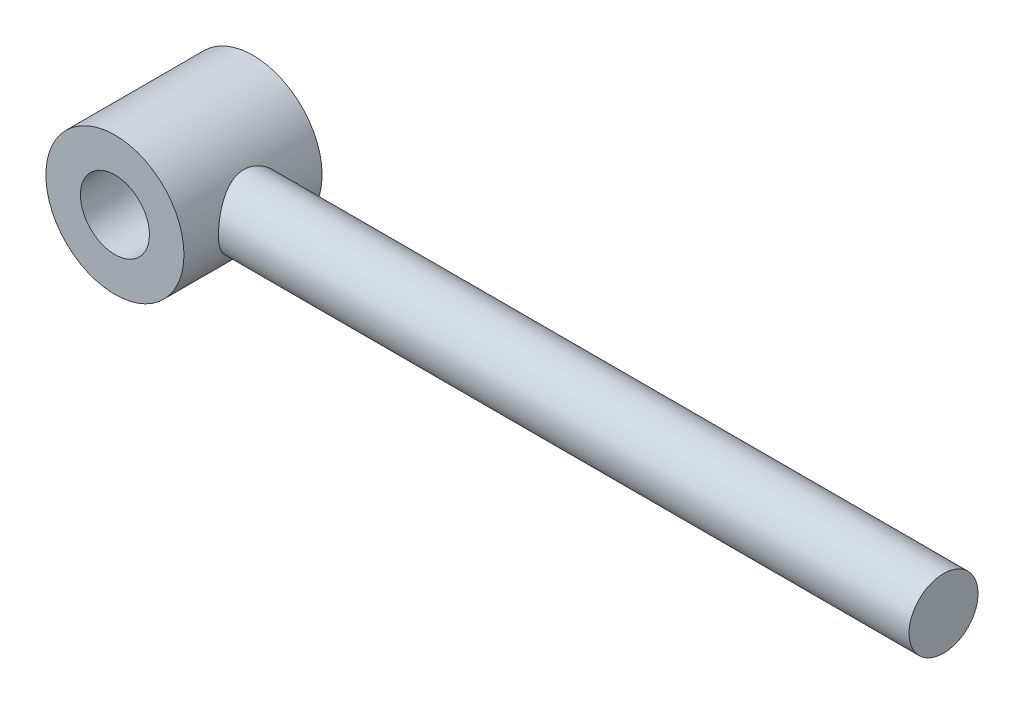
ISO-10303-21;
HEADER;
FILE_DESCRIPTION(('STEP AP214'),'2;1');
FILE_NAME('part.step','',(''),(''),'','','');
FILE_SCHEMA(('AUTOMOTIVE_DESIGN { 1 0 10303 214 1 1 1 1 }'));
ENDSEC;
DATA;
#1=APPLICATION_CONTEXT('core data for automotive mechanical design processes');
#2=APPLICATION_PROTOCOL_DEFINITION('international standard','automotive_design',2000,#1);
#3=PRODUCT_CONTEXT('',#1,'mechanical');
#4=PRODUCT('Part','Part','',(#3));
#5=PRODUCT_RELATED_PRODUCT_CATEGORY('part','',(#4));
#6=PRODUCT_DEFINITION_FORMATION('','',#4);
#7=PRODUCT_DEFINITION_CONTEXT('part definition',#1,'design');
#8=PRODUCT_DEFINITION('design','',#6,#7);
#9=PRODUCT_DEFINITION_SHAPE('','',#8);
#10=(LENGTH_UNIT() NAMED_UNIT(*) SI_UNIT(.MILLI.,.METRE.));
#11=(NAMED_UNIT(*) PLANE_ANGLE_UNIT() SI_UNIT($,.RADIAN.));
#12=(NAMED_UNIT(*) SI_UNIT($,.STERADIAN.) SOLID_ANGLE_UNIT());
#13=UNCERTAINTY_MEASURE_WITH_UNIT(LENGTH_MEASURE(1.E-05),#10,'distance_accuracy_value','');
#14=(GEOMETRIC_REPRESENTATION_CONTEXT(3) GLOBAL_UNCERTAINTY_ASSIGNED_CONTEXT((#13)) GLOBAL_UNIT_ASSIGNED_CONTEXT((#10,
#11,#12)) REPRESENTATION_CONTEXT('',''));
#15=CARTESIAN_POINT('',(0.,0.,0.));
#16=DIRECTION('',(0.,0.,1.));
#17=DIRECTION('',(1.,0.,0.));
#18=AXIS2_PLACEMENT_3D('',#15,#16,#17);
#19=CARTESIAN_POINT('',(0.,0.,20.));
#20=DIRECTION('',(0.,0.,-1.));
#21=DIRECTION('',(-1.,0.,0.));
#22=AXIS2_PLACEMENT_3D('',#19,#20,#21);
#23=CYLINDRICAL_SURFACE('',#22,10.);
#24=CARTESIAN_POINT('',(0.,0.,20.));
#25=DIRECTION('',(0.,0.,1.));
#26=DIRECTION('',(1.,0.,0.));
#27=AXIS2_PLACEMENT_3D('',#24,#25,#26);
#28=CIRCLE('',#27,10.);
#29=CARTESIAN_POINT('',(10.,0.,20.));
#30=VERTEX_POINT('',#29);
#31=EDGE_CURVE('E54',#30,#30,#28,.T.);
#32=ORIENTED_EDGE('',*,*,#31,.F.);
#33=EDGE_LOOP('',(#32));
#34=FACE_BOUND('',#33,.T.);
#35=CARTESIAN_POINT('',(0.,0.,0.));
#36=DIRECTION('',(0.,0.,1.));
#37=DIRECTION('',(1.,0.,0.));
#38=AXIS2_PLACEMENT_3D('',#35,#36,#37);
#39=CIRCLE('',#38,10.);
#40=CARTESIAN_POINT('',(10.,0.,0.));
#41=VERTEX_POINT('',#40);
#42=EDGE_CURVE('E58',#41,#41,#39,.T.);
#43=ORIENTED_EDGE('',*,*,#42,.T.);
#44=EDGE_LOOP('',(#43));
#45=FACE_BOUND('',#44,.T.);
#46=CARTESIAN_POINT('',(10.,0.,5.00000000000007));
#47=CARTESIAN_POINT('',(9.99999960171885,0.131488890078729,5.0000004322161));
#48=CARTESIAN_POINT('',(9.99740053121284,0.262986970217152,5.00519277528519));
#49=CARTESIAN_POINT('',(9.98706977835168,0.525014586348057,5.0259028941121));
#50=CARTESIAN_POINT('',(9.97933586314931,0.655543676003296,5.04142516176405));
#51=CARTESIAN_POINT('',(9.95892066969002,0.914783203431135,5.08264077947741));
#52=CARTESIAN_POINT('',(9.94623233642882,1.04349077535257,5.10834863440631));
#53=CARTESIAN_POINT('',(9.91622716576671,1.29802636754293,5.16965067256353));
#54=CARTESIAN_POINT('',(9.89890843630383,1.42385318781692,5.2052488974057));
#55=CARTESIAN_POINT('',(9.86015430154804,1.67121386584967,5.28577848245137));
#56=CARTESIAN_POINT('',(9.83873709670758,1.79276399094562,5.33066864854812));
#57=CARTESIAN_POINT('',(9.79224427489324,2.0314444775119,5.42944879780702));
#58=CARTESIAN_POINT('',(9.7671672814684,2.14857315511666,5.48334216819352));
#59=CARTESIAN_POINT('',(9.68730860488736,2.49222561412915,5.65779962893905));
#60=CARTESIAN_POINT('',(9.6278546021617,2.71128846115304,5.79123077324013));
#61=CARTESIAN_POINT('',(9.49780663424161,3.13758045755124,6.09760528124462));
#62=CARTESIAN_POINT('',(9.42675632671347,3.34329192972868,6.27245069027979));
#63=CARTESIAN_POINT('',(9.28300214475253,3.72388133818108,6.65258908828323));
#64=CARTESIAN_POINT('',(9.21029705743542,3.89873577832563,6.85790506198392));
#65=CARTESIAN_POINT('',(9.06493867332992,4.22628385620055,7.31247514746435));
#66=CARTESIAN_POINT('',(8.99272664170301,4.37620734766694,7.56390189131755));
#67=CARTESIAN_POINT('',(8.89637417546677,4.56723365243868,7.95991804436766));
#68=CARTESIAN_POINT('',(8.86624279684719,4.62527981130998,8.09511829056034));
#69=CARTESIAN_POINT('',(8.81109611627222,4.72948843578257,8.37100125177413));
#70=CARTESIAN_POINT('',(8.78607778701962,4.77565793744269,8.51168066363924));
#71=CARTESIAN_POINT('',(8.74350562362058,4.8531380584616,8.78899275415604));
#72=CARTESIAN_POINT('',(8.72559704108876,4.88516762296958,8.925370479978));
#73=CARTESIAN_POINT('',(8.69596333711106,4.93772573892405,9.20092569747969));
#74=CARTESIAN_POINT('',(8.68423493515241,4.95826039236648,9.34010166300617));
#75=CARTESIAN_POINT('',(8.66746161087014,4.98752398958936,9.6200074611113));
#76=CARTESIAN_POINT('',(8.66241266349288,4.99626004329765,9.76073630631417));
#77=CARTESIAN_POINT('',(8.65921299638945,5.00180399494055,10.0425011762897));
#78=CARTESIAN_POINT('',(8.66106161851229,4.99861303092504,10.1835371704714));
#79=CARTESIAN_POINT('',(8.67093727173593,4.98145803092846,10.447703572877));
#80=CARTESIAN_POINT('',(8.6781966350113,4.96883208371091,10.5709526028103));
#81=CARTESIAN_POINT('',(8.69773906996623,4.93454402662215,10.8158212139672));
#82=CARTESIAN_POINT('',(8.71002371946268,4.91287907868334,10.937440271022));
#83=CARTESIAN_POINT('',(8.73921479576949,4.86076278292653,11.1781978743128));
#84=CARTESIAN_POINT('',(8.75612065195561,4.83031251988904,11.2973367248501));
#85=CARTESIAN_POINT('',(8.79403073984606,4.76094319159974,11.5324713769545));
#86=CARTESIAN_POINT('',(8.81503658165343,4.72202079856857,11.6484659232761));
#87=CARTESIAN_POINT('',(8.88436032421636,4.59108661358502,11.9960068716187));
#88=CARTESIAN_POINT('',(8.93828791833521,4.48608785825887,12.2216933560379));
#89=CARTESIAN_POINT('',(9.05517433078603,4.24519591002764,12.6532101182229));
#90=CARTESIAN_POINT('',(9.11813720101033,4.10928884013355,12.8590314177593));
#91=CARTESIAN_POINT('',(9.25565455759079,3.79034422310328,13.2725885282039));
#92=CARTESIAN_POINT('',(9.3306665420313,3.60351571642877,13.4772580077074));
#93=CARTESIAN_POINT('',(9.47739013910051,3.19773444843253,13.8537034656888));
#94=CARTESIAN_POINT('',(9.54910016205801,2.97876642220598,14.0254637238213));
#95=CARTESIAN_POINT('',(9.65034506582221,2.62430600098781,14.2584408971133));
#96=CARTESIAN_POINT('',(9.68370380274255,2.49871002336159,14.3333520951456));
#97=CARTESIAN_POINT('',(9.74663052718473,2.2407106014256,14.4722082029725));
#98=CARTESIAN_POINT('',(9.77620011135783,2.10831005755409,14.5361577355912));
#99=CARTESIAN_POINT('',(9.83067553510546,1.83762803314803,14.6523988753835));
#100=CARTESIAN_POINT('',(9.85558325144946,1.69934894682178,14.7046951755249));
#101=CARTESIAN_POINT('',(9.89999026457503,1.41791187896083,14.79702492908));
#102=CARTESIAN_POINT('',(9.91949018350378,1.27475446078987,14.8370597931822));
#103=CARTESIAN_POINT('',(9.95109597328192,0.996798015430409,14.9015335635031));
#104=CARTESIAN_POINT('',(9.96368046334326,0.862288674029794,14.9269895154025));
#105=CARTESIAN_POINT('',(9.98343035732268,0.591248360012463,14.9668080412237));
#106=CARTESIAN_POINT('',(9.99059624028198,0.454717567193948,14.9811715957902));
#107=CARTESIAN_POINT('',(9.99930380487356,0.180810709359644,14.9986131620341));
#108=CARTESIAN_POINT('',(10.000847639673,0.0434349881358962,15.001695494267));
#109=CARTESIAN_POINT('',(9.99827237859039,-0.231047608581554,14.9965444260813));
#110=CARTESIAN_POINT('',(9.99415353332644,-0.368154495704343,14.9883115264508));
#111=CARTESIAN_POINT('',(9.98090973082445,-0.630324023952247,14.961721326159));
#112=CARTESIAN_POINT('',(9.97219922243105,-0.75549375124322,14.9442016224067));
#113=CARTESIAN_POINT('',(9.95027227352716,-1.00380426086804,14.8998255264295));
#114=CARTESIAN_POINT('',(9.93705440583578,-1.12694438760008,14.8729661769068));
#115=CARTESIAN_POINT('',(9.90642450404114,-1.37032307172126,14.8101973166376));
#116=CARTESIAN_POINT('',(9.88901375346268,-1.49056250470176,14.7742905753219));
#117=CARTESIAN_POINT('',(9.85039368148873,-1.72747946867538,14.6937718386769));
#118=CARTESIAN_POINT('',(9.82918290524069,-1.84415561535681,14.6491565086474));
#119=CARTESIAN_POINT('',(9.75922876416582,-2.19430354472275,14.5000521931498));
#120=CARTESIAN_POINT('',(9.70504904478179,-2.42111320848944,14.382059258215));
#121=CARTESIAN_POINT('',(9.58719375745592,-2.8523456015808,14.1144478067804));
#122=CARTESIAN_POINT('',(9.52351414776381,-3.05675873773466,13.9648158180078));
#123=CARTESIAN_POINT('',(9.38541505392104,-3.45882132675025,13.6212127089634));
#124=CARTESIAN_POINT('',(9.31055499361995,-3.65383533419945,13.4243304082476));
#125=CARTESIAN_POINT('',(9.16310881759143,-4.00930667677967,13.0003294628661));
#126=CARTESIAN_POINT('',(9.09052430437332,-4.16974010650664,12.7731900760017));
#127=CARTESIAN_POINT('',(8.98785260582618,-4.38466016919211,12.4075094337708));
#128=CARTESIAN_POINT('',(8.95395955241383,-4.4532676226712,12.2781491254566));
#129=CARTESIAN_POINT('',(8.89022352415078,-4.57918112262683,12.0131058992211));
#130=CARTESIAN_POINT('',(8.86037871680369,-4.63649228788887,11.8774258796241));
#131=CARTESIAN_POINT('',(8.80590327365628,-4.73913999074898,11.6007229646748));
#132=CARTESIAN_POINT('',(8.78126837994729,-4.78448631442401,11.45970454425));
#133=CARTESIAN_POINT('',(8.73822819098157,-4.86265004333096,11.1733089571752));
#134=CARTESIAN_POINT('',(8.7198219312185,-4.89546938847111,11.0279324691725));
#135=CARTESIAN_POINT('',(8.69151275671387,-4.94553834792943,10.7482350184648));
#136=CARTESIAN_POINT('',(8.6809632703526,-4.96397997433445,10.6141921168801));
#137=CARTESIAN_POINT('',(8.66606824539578,-4.98993873206133,10.3447147543027));
#138=CARTESIAN_POINT('',(8.66172205679783,-4.99745700797003,10.2092804406049));
#139=CARTESIAN_POINT('',(8.65941425656731,-5.00145477351748,9.93824307499543));
#140=CARTESIAN_POINT('',(8.66145040076354,-4.99793814327599,9.80264009915044));
#141=CARTESIAN_POINT('',(8.67181681785816,-4.97992974203946,9.53241444205219));
#142=CARTESIAN_POINT('',(8.68014683308828,-4.96543842034336,9.39779172089553));
#143=CARTESIAN_POINT('',(8.70167828744801,-4.92759757627216,9.14343979784105));
#144=CARTESIAN_POINT('',(8.71433770908853,-4.90522766015,9.02351744037614));
#145=CARTESIAN_POINT('',(8.74411599480516,-4.85194376743194,8.78613880943259));
#146=CARTESIAN_POINT('',(8.76123623781642,-4.82102714868722,8.66868331066602));
#147=CARTESIAN_POINT('',(8.81854231868725,-4.71590306073959,8.32108288488716));
#148=CARTESIAN_POINT('',(8.8646881377113,-4.62929708984156,8.09554390501406));
#149=CARTESIAN_POINT('',(8.97142890954605,-4.4190716467502,7.64683965768755));
#150=CARTESIAN_POINT('',(9.03278633647389,-4.29335633682031,7.42485192401071));
#151=CARTESIAN_POINT('',(9.1617663649522,-4.01075421010744,7.00363589040434));
#152=CARTESIAN_POINT('',(9.22939221620456,-3.85385117607732,6.80441951655589));
#153=CARTESIAN_POINT('',(9.37311444600789,-3.49102748964406,6.40929214152935));
#154=CARTESIAN_POINT('',(9.44924162905911,-3.28146736342599,6.21672398123245));
#155=CARTESIAN_POINT('',(9.59389514971535,-2.83072875767415,5.86866557881679));
#156=CARTESIAN_POINT('',(9.66241737976037,-2.58953334336126,5.7131953222565));
#157=CARTESIAN_POINT('',(9.7541901337583,-2.20753881885374,5.51136958547325));
#158=CARTESIAN_POINT('',(9.78304209980294,-2.0762551257027,5.44913292059369));
#159=CARTESIAN_POINT('',(9.83614745234556,-1.80799529933998,5.33606384387969));
#160=CARTESIAN_POINT('',(9.8604030970797,-1.67102200205151,5.28522582946945));
#161=CARTESIAN_POINT('',(9.90354484128718,-1.39269501068688,5.19565456163288));
#162=CARTESIAN_POINT('',(9.92244264379385,-1.25135162347081,5.15689490701236));
#163=CARTESIAN_POINT('',(9.95434618112011,-0.965237205795559,5.0918624037315));
#164=CARTESIAN_POINT('',(9.96735551489675,-0.820468326048375,5.06558192747304));
#165=CARTESIAN_POINT('',(9.98476387878718,-0.563041654408161,5.03052546800121));
#166=CARTESIAN_POINT('',(9.99046741601666,-0.450825809730025,5.01908824630805));
#167=CARTESIAN_POINT('',(9.99808569986015,-0.225742246050265,5.00382522174992));
#168=CARTESIAN_POINT('',(10.000000341898,-0.112874509142188,4.99999962897122));
#169=CARTESIAN_POINT('',(10.,0.,5.00000000000007));
#170=B_SPLINE_CURVE_WITH_KNOTS('',3,(#46,#47,#48,#49,#50,#51,#52,#53,#54,#55,#56,#57,#58,#59,
#60,#61,#62,#63,#64,#65,#66,#67,#68,#69,#70,#71,#72,#73,#74,#75,#76,#77,#78,#79,#80,#81,#82,#83,
#84,#85,#86,#87,#88,#89,#90,#91,#92,#93,#94,#95,#96,#97,#98,#99,#100,#101,#102,#103,#104,#105,
#106,#107,#108,#109,#110,#111,#112,#113,#114,#115,#116,#117,#118,#119,#120,#121,#122,#123,#124,
#125,#126,#127,#128,#129,#130,#131,#132,#133,#134,#135,#136,#137,#138,#139,#140,#141,#142,#143,
#144,#145,#146,#147,#148,#149,#150,#151,#152,#153,#154,#155,#156,#157,#158,#159,#160,#161,#162,
#163,#164,#165,#166,#167,#168,#169),.UNSPECIFIED.,.T.,.F.,(4,2,2,2,2,2,2,2,2,2,2,2,2,2,2,2,2,2,
2,2,2,2,2,2,2,2,2,2,2,2,2,2,2,2,2,2,2,2,2,2,2,2,2,2,2,2,2,2,2,2,2,2,2,2,2,2,2,2,2,2,2,4),(0.,
0.394355294649891,0.788882184037819,1.18397293369035,1.57922537181693,1.97276168530542,
2.36644639154632,3.15295441699267,3.98704440767527,4.82176680235501,5.72122193562246,
6.17125359989459,6.62101803579305,7.04410338623952,7.46696393118358,7.88956954321096,
8.3121348321667,8.68401534897462,9.05601271689168,9.42796417149684,9.80006198990959,
10.56083380205,11.3219478566368,12.1795688603196,13.03759852356,13.4870830845772,
13.9363776171859,14.3854908824168,14.8345524573652,15.2464230691107,15.6582572644723,
16.0699337163998,16.4815919489941,16.8612200640511,17.240968493866,17.6206008225791,
18.0003788066131,18.7808755264614,19.5617052624835,20.4192132572739,21.2773121558255,
21.7277011924365,22.1778856687596,22.6277007885002,23.0774462222894,23.4840267197959,
23.8905646113036,24.2969595710184,24.703337894006,25.0708552370355,25.4384863225851,
26.1732662495599,26.9574126491567,27.7419678673239,28.6218519479817,29.5022089791541,
29.9460734671028,30.3897193096443,30.8323885049027,31.2747867798493,31.6133053554877,
31.9518332743451),.UNSPECIFIED.);
#171=CARTESIAN_POINT('',(10.,0.,5.00000000000007));
#172=VERTEX_POINT('',#171);
#173=EDGE_CURVE('E10',#172,#172,#170,.T.);
#174=ORIENTED_EDGE('',*,*,#173,.F.);
#175=EDGE_LOOP('',(#174));
#176=FACE_BOUND('',#175,.T.);
#177=ADVANCED_FACE('F43',(#34,#45,#176),#23,.T.);
#178=CARTESIAN_POINT('',(0.,0.,20.));
#179=DIRECTION('',(0.,0.,1.));
#180=DIRECTION('',(1.,0.,0.));
#181=AXIS2_PLACEMENT_3D('',#178,#179,#180);
#182=PLANE('',#181);
#183=ORIENTED_EDGE('',*,*,#31,.T.);
#184=EDGE_LOOP('',(#183));
#185=FACE_BOUND('',#184,.T.);
#186=CARTESIAN_POINT('',(0.,0.,20.));
#187=DIRECTION('',(0.,0.,1.));
#188=DIRECTION('',(1.,0.,0.));
#189=AXIS2_PLACEMENT_3D('',#186,#187,#188);
#190=CIRCLE('',#189,5.);
#191=CARTESIAN_POINT('',(5.,0.,20.));
#192=VERTEX_POINT('',#191);
#193=EDGE_CURVE('E63',#192,#192,#190,.T.);
#194=ORIENTED_EDGE('',*,*,#193,.F.);
#195=EDGE_LOOP('',(#194));
#196=FACE_BOUND('',#195,.T.);
#197=ADVANCED_FACE('F89',(#185,#196),#182,.T.);
#198=CARTESIAN_POINT('',(0.,0.,0.));
#199=DIRECTION('',(0.,0.,1.));
#200=DIRECTION('',(1.,0.,0.));
#201=AXIS2_PLACEMENT_3D('',#198,#199,#200);
#202=PLANE('',#201);
#203=ORIENTED_EDGE('',*,*,#42,.F.);
#204=EDGE_LOOP('',(#203));
#205=FACE_BOUND('',#204,.T.);
#206=CARTESIAN_POINT('',(0.,0.,0.));
#207=DIRECTION('',(0.,0.,1.));
#208=DIRECTION('',(1.,0.,0.));
#209=AXIS2_PLACEMENT_3D('',#206,#207,#208);
#210=CIRCLE('',#209,5.);
#211=CARTESIAN_POINT('',(5.,0.,0.));
#212=VERTEX_POINT('',#211);
#213=EDGE_CURVE('E65',#212,#212,#210,.T.);
#214=ORIENTED_EDGE('',*,*,#213,.T.);
#215=EDGE_LOOP('',(#214));
#216=FACE_BOUND('',#215,.T.);
#217=ADVANCED_FACE('F85',(#205,#216),#202,.F.);
#218=CARTESIAN_POINT('',(0.,0.,20.));
#219=DIRECTION('',(0.,0.,-1.));
#220=DIRECTION('',(-1.,0.,0.));
#221=AXIS2_PLACEMENT_3D('',#218,#219,#220);
#222=CYLINDRICAL_SURFACE('',#221,5.);
#223=ORIENTED_EDGE('',*,*,#193,.T.);
#224=EDGE_LOOP('',(#223));
#225=FACE_BOUND('',#224,.T.);
#226=ORIENTED_EDGE('',*,*,#213,.F.);
#227=EDGE_LOOP('',(#226));
#228=FACE_BOUND('',#227,.T.);
#229=ADVANCED_FACE('F78',(#225,#228),#222,.F.);
#230=CARTESIAN_POINT('',(110.,0.,10.0000000000008));
#231=DIRECTION('',(-1.,0.,0.));
#232=DIRECTION('',(0.,0.,1.));
#233=AXIS2_PLACEMENT_3D('',#230,#231,#232);
#234=PLANE('',#233);
#235=CARTESIAN_POINT('',(110.,0.,10.0000000000008));
#236=DIRECTION('',(-1.,0.,0.));
#237=DIRECTION('',(0.,0.,1.));
#238=AXIS2_PLACEMENT_3D('',#235,#236,#237);
#239=CIRCLE('',#238,5.);
#240=CARTESIAN_POINT('',(110.,0.,15.0000000000008));
#241=VERTEX_POINT('',#240);
#242=EDGE_CURVE('E68',#241,#241,#239,.T.);
#243=ORIENTED_EDGE('',*,*,#242,.F.);
#244=EDGE_LOOP('',(#243));
#245=FACE_BOUND('',#244,.T.);
#246=ADVANCED_FACE('F76',(#245),#234,.F.);
#247=CARTESIAN_POINT('',(-10.0019999999999,0.,9.99999999999993));
#248=DIRECTION('',(1.,0.,0.));
#249=DIRECTION('',(0.,0.,-1.));
#250=AXIS2_PLACEMENT_3D('',#247,#248,#249);
#251=CYLINDRICAL_SURFACE('',#250,5.);
#252=ORIENTED_EDGE('',*,*,#242,.T.);
#253=EDGE_LOOP('',(#252));
#254=FACE_BOUND('',#253,.T.);
#255=ORIENTED_EDGE('',*,*,#173,.T.);
#256=EDGE_LOOP('',(#255));
#257=FACE_BOUND('',#256,.T.);
#258=ADVANCED_FACE('F74',(#254,#257),#251,.T.);
#259=CLOSED_SHELL('',(#177,#197,#217,#229,#246,#258));
#260=MANIFOLD_SOLID_BREP('B2',#259);
#261=ADVANCED_BREP_SHAPE_REPRESENTATION('',(#18,#260),#14);
#262=SHAPE_DEFINITION_REPRESENTATION(#9,#261);
ENDSEC;
END-ISO-10303-21;
